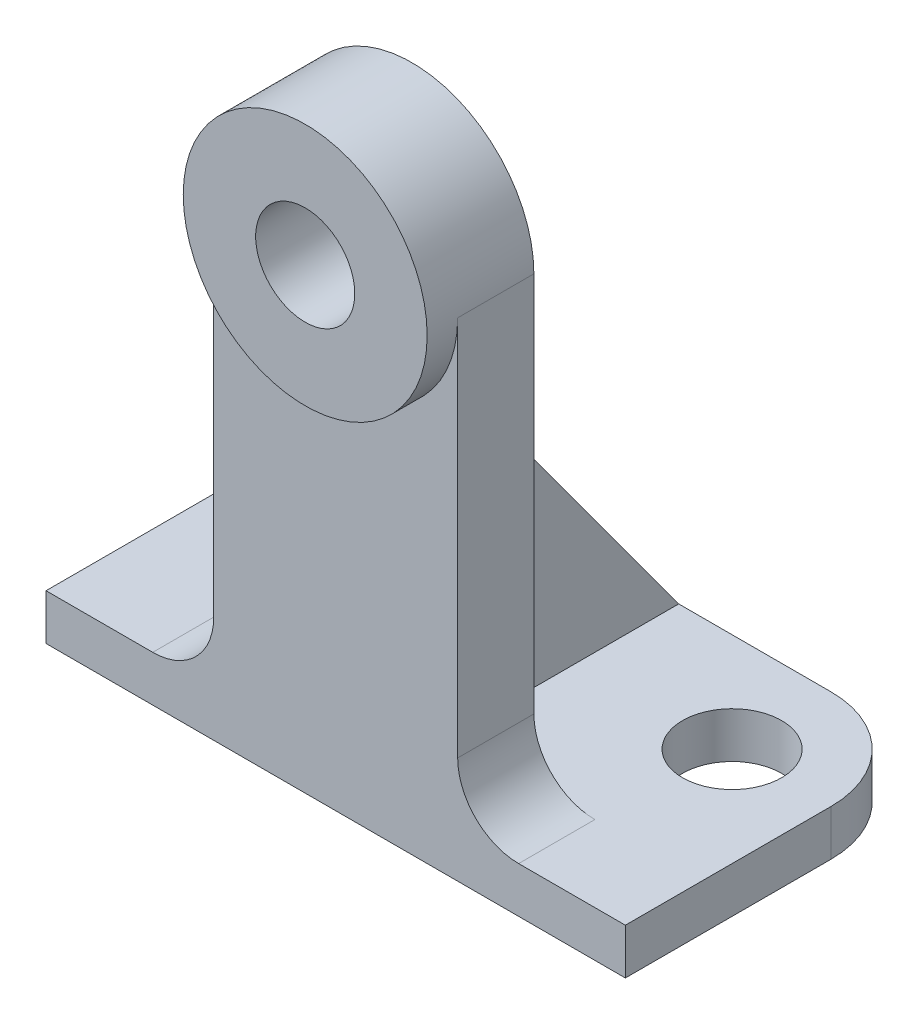
ISO-10303-21;
HEADER;
FILE_DESCRIPTION(('STEP AP214'),'2;1');
FILE_NAME('part.step','',(''),(''),'','','');
FILE_SCHEMA(('AUTOMOTIVE_DESIGN { 1 0 10303 214 1 1 1 1 }'));
ENDSEC;
DATA;
#1=APPLICATION_CONTEXT('core data for automotive mechanical design processes');
#2=APPLICATION_PROTOCOL_DEFINITION('international standard','automotive_design',2000,#1);
#3=PRODUCT_CONTEXT('',#1,'mechanical');
#4=PRODUCT('Part','Part','',(#3));
#5=PRODUCT_RELATED_PRODUCT_CATEGORY('part','',(#4));
#6=PRODUCT_DEFINITION_FORMATION('','',#4);
#7=PRODUCT_DEFINITION_CONTEXT('part definition',#1,'design');
#8=PRODUCT_DEFINITION('design','',#6,#7);
#9=PRODUCT_DEFINITION_SHAPE('','',#8);
#10=(LENGTH_UNIT() NAMED_UNIT(*) SI_UNIT(.MILLI.,.METRE.));
#11=(NAMED_UNIT(*) PLANE_ANGLE_UNIT() SI_UNIT($,.RADIAN.));
#12=(NAMED_UNIT(*) SI_UNIT($,.STERADIAN.) SOLID_ANGLE_UNIT());
#13=UNCERTAINTY_MEASURE_WITH_UNIT(LENGTH_MEASURE(1.E-05),#10,'distance_accuracy_value','');
#14=(GEOMETRIC_REPRESENTATION_CONTEXT(3) GLOBAL_UNCERTAINTY_ASSIGNED_CONTEXT((#13)) GLOBAL_UNIT_ASSIGNED_CONTEXT((#10,
#11,#12)) REPRESENTATION_CONTEXT('',''));
#15=CARTESIAN_POINT('',(0.,0.,0.));
#16=DIRECTION('',(0.,0.,1.));
#17=DIRECTION('',(1.,0.,0.));
#18=AXIS2_PLACEMENT_3D('',#15,#16,#17);
#19=CARTESIAN_POINT('',(0.,0.,0.));
#20=DIRECTION('',(0.,1.,0.));
#21=DIRECTION('',(0.,0.,1.));
#22=AXIS2_PLACEMENT_3D('',#19,#20,#21);
#23=PLANE('',#22);
#24=CARTESIAN_POINT('',(-25.,0.,-7.));
#25=DIRECTION('',(0.,1.,0.));
#26=DIRECTION('',(0.,0.,-1.));
#27=AXIS2_PLACEMENT_3D('',#24,#25,#26);
#28=CIRCLE('',#27,6.5);
#29=CARTESIAN_POINT('',(-25.,0.,-13.5));
#30=VERTEX_POINT('',#29);
#31=EDGE_CURVE('E225',#30,#30,#28,.T.);
#32=ORIENTED_EDGE('',*,*,#31,.F.);
#33=EDGE_LOOP('',(#32));
#34=FACE_BOUND('',#33,.T.);
#35=DIRECTION('',(-1.,0.,0.));
#36=VECTOR('',#35,1.);
#37=CARTESIAN_POINT('',(-38.,0.,-20.));
#38=LINE('',#37,#36);
#39=CARTESIAN_POINT('',(-5.,0.,-20.));
#40=VERTEX_POINT('',#39);
#41=CARTESIAN_POINT('',(-25.,0.,-20.));
#42=VERTEX_POINT('',#41);
#43=EDGE_CURVE('E174',#40,#42,#38,.T.);
#44=ORIENTED_EDGE('',*,*,#43,.T.);
#45=CARTESIAN_POINT('',(-25.,0.,-7.));
#46=DIRECTION('',(0.,1.,0.));
#47=DIRECTION('',(0.,0.,1.));
#48=AXIS2_PLACEMENT_3D('',#45,#46,#47);
#49=CIRCLE('',#48,13.);
#50=CARTESIAN_POINT('',(-38.,0.,-7.));
#51=VERTEX_POINT('',#50);
#52=EDGE_CURVE('E211',#42,#51,#49,.T.);
#53=ORIENTED_EDGE('',*,*,#52,.T.);
#54=DIRECTION('',(0.,0.,1.));
#55=VECTOR('',#54,1.);
#56=CARTESIAN_POINT('',(-38.,0.,-20.));
#57=LINE('',#56,#55);
#58=CARTESIAN_POINT('',(-38.,0.,20.));
#59=VERTEX_POINT('',#58);
#60=EDGE_CURVE('E188',#51,#59,#57,.T.);
#61=ORIENTED_EDGE('',*,*,#60,.T.);
#62=DIRECTION('',(1.,0.,0.));
#63=VECTOR('',#62,1.);
#64=CARTESIAN_POINT('',(-38.,0.,20.));
#65=LINE('',#64,#63);
#66=CARTESIAN_POINT('',(-24.,0.,20.));
#67=VERTEX_POINT('',#66);
#68=EDGE_CURVE('E196',#59,#67,#65,.T.);
#69=ORIENTED_EDGE('',*,*,#68,.T.);
#70=DIRECTION('',(0.,0.,1.));
#71=VECTOR('',#70,1.);
#72=CARTESIAN_POINT('',(-24.,0.,10.));
#73=LINE('',#72,#71);
#74=CARTESIAN_POINT('',(-24.,0.,10.));
#75=VERTEX_POINT('',#74);
#76=EDGE_CURVE('E268',#75,#67,#73,.T.);
#77=ORIENTED_EDGE('',*,*,#76,.F.);
#78=DIRECTION('',(-1.,0.,0.));
#79=VECTOR('',#78,1.);
#80=CARTESIAN_POINT('',(0.,0.,10.));
#81=LINE('',#80,#79);
#82=CARTESIAN_POINT('',(-5.,0.,10.));
#83=VERTEX_POINT('',#82);
#84=EDGE_CURVE('E176',#83,#75,#81,.T.);
#85=ORIENTED_EDGE('',*,*,#84,.F.);
#86=DIRECTION('',(0.,0.,1.));
#87=VECTOR('',#86,1.);
#88=CARTESIAN_POINT('',(-5.,0.,-20.));
#89=LINE('',#88,#87);
#90=EDGE_CURVE('E169',#40,#83,#89,.T.);
#91=ORIENTED_EDGE('',*,*,#90,.F.);
#92=EDGE_LOOP('',(#44,#53,#61,#69,#77,#85,#91));
#93=FACE_BOUND('',#92,.T.);
#94=ADVANCED_FACE('F41',(#34,#93),#23,.T.);
#95=CARTESIAN_POINT('',(25.,0.,-7.));
#96=DIRECTION('',(0.,1.,0.));
#97=DIRECTION('',(0.,0.,1.));
#98=AXIS2_PLACEMENT_3D('',#95,#96,#97);
#99=CIRCLE('',#98,6.5);
#100=CARTESIAN_POINT('',(25.,0.,-0.500000000000004));
#101=VERTEX_POINT('',#100);
#102=EDGE_CURVE('E220',#101,#101,#99,.T.);
#103=ORIENTED_EDGE('',*,*,#102,.F.);
#104=EDGE_LOOP('',(#103));
#105=FACE_BOUND('',#104,.T.);
#106=DIRECTION('',(0.,0.,-1.));
#107=VECTOR('',#106,1.);
#108=CARTESIAN_POINT('',(38.,0.,-20.));
#109=LINE('',#108,#107);
#110=CARTESIAN_POINT('',(38.,0.,20.));
#111=VERTEX_POINT('',#110);
#112=CARTESIAN_POINT('',(38.,0.,-7.));
#113=VERTEX_POINT('',#112);
#114=EDGE_CURVE('E186',#111,#113,#109,.T.);
#115=ORIENTED_EDGE('',*,*,#114,.T.);
#116=CARTESIAN_POINT('',(25.,0.,-7.));
#117=DIRECTION('',(0.,1.,0.));
#118=DIRECTION('',(0.,0.,1.));
#119=AXIS2_PLACEMENT_3D('',#116,#117,#118);
#120=CIRCLE('',#119,13.);
#121=CARTESIAN_POINT('',(25.,0.,-20.));
#122=VERTEX_POINT('',#121);
#123=EDGE_CURVE('E11',#113,#122,#120,.T.);
#124=ORIENTED_EDGE('',*,*,#123,.T.);
#125=CARTESIAN_POINT('',(5.,0.,-20.));
#126=VERTEX_POINT('',#125);
#127=EDGE_CURVE('E185',#122,#126,#38,.T.);
#128=ORIENTED_EDGE('',*,*,#127,.T.);
#129=DIRECTION('',(0.,0.,1.));
#130=VECTOR('',#129,1.);
#131=CARTESIAN_POINT('',(5.,0.,-20.));
#132=LINE('',#131,#130);
#133=CARTESIAN_POINT('',(5.,0.,10.));
#134=VERTEX_POINT('',#133);
#135=EDGE_CURVE('E178',#126,#134,#132,.T.);
#136=ORIENTED_EDGE('',*,*,#135,.T.);
#137=CARTESIAN_POINT('',(24.,0.,10.));
#138=VERTEX_POINT('',#137);
#139=EDGE_CURVE('E252',#138,#134,#81,.T.);
#140=ORIENTED_EDGE('',*,*,#139,.F.);
#141=DIRECTION('',(0.,0.,1.));
#142=VECTOR('',#141,1.);
#143=CARTESIAN_POINT('',(24.,0.,10.));
#144=LINE('',#143,#142);
#145=CARTESIAN_POINT('',(24.,0.,20.));
#146=VERTEX_POINT('',#145);
#147=EDGE_CURVE('E288',#138,#146,#144,.T.);
#148=ORIENTED_EDGE('',*,*,#147,.T.);
#149=EDGE_CURVE('E195',#146,#111,#65,.T.);
#150=ORIENTED_EDGE('',*,*,#149,.T.);
#151=EDGE_LOOP('',(#115,#124,#128,#136,#140,#148,#150));
#152=FACE_BOUND('',#151,.T.);
#153=ADVANCED_FACE('F341',(#105,#152),#23,.T.);
#154=CARTESIAN_POINT('',(0.,0.,10.));
#155=DIRECTION('',(0.,0.,1.));
#156=DIRECTION('',(1.,0.,0.));
#157=AXIS2_PLACEMENT_3D('',#154,#155,#156);
#158=PLANE('',#157);
#159=DIRECTION('',(0.,-1.,0.));
#160=VECTOR('',#159,1.);
#161=CARTESIAN_POINT('',(5.,0.,10.));
#162=LINE('',#161,#160);
#163=CARTESIAN_POINT('',(5.,41.,10.));
#164=VERTEX_POINT('',#163);
#165=EDGE_CURVE('E235',#164,#134,#162,.T.);
#166=ORIENTED_EDGE('',*,*,#165,.F.);
#167=DIRECTION('',(1.,0.,0.));
#168=VECTOR('',#167,1.);
#169=CARTESIAN_POINT('',(5.,41.,10.));
#170=LINE('',#169,#168);
#171=CARTESIAN_POINT('',(-5.,41.,10.));
#172=VERTEX_POINT('',#171);
#173=EDGE_CURVE('E233',#172,#164,#170,.T.);
#174=ORIENTED_EDGE('',*,*,#173,.F.);
#175=DIRECTION('',(0.,1.,0.));
#176=VECTOR('',#175,1.);
#177=CARTESIAN_POINT('',(-5.,41.,10.));
#178=LINE('',#177,#176);
#179=EDGE_CURVE('E162',#83,#172,#178,.T.);
#180=ORIENTED_EDGE('',*,*,#179,.F.);
#181=ORIENTED_EDGE('',*,*,#84,.T.);
#182=CARTESIAN_POINT('',(-24.,8.,10.));
#183=DIRECTION('',(0.,0.,1.));
#184=DIRECTION('',(1.,0.,0.));
#185=AXIS2_PLACEMENT_3D('',#182,#183,#184);
#186=CIRCLE('',#185,8.);
#187=CARTESIAN_POINT('',(-16.,8.,10.));
#188=VERTEX_POINT('',#187);
#189=EDGE_CURVE('E248',#188,#75,#186,.F.);
#190=ORIENTED_EDGE('',*,*,#189,.F.);
#191=DIRECTION('',(0.,-1.,0.));
#192=VECTOR('',#191,1.);
#193=CARTESIAN_POINT('',(-16.,0.,10.));
#194=LINE('',#193,#192);
#195=CARTESIAN_POINT('',(-16.,58.,10.));
#196=VERTEX_POINT('',#195);
#197=EDGE_CURVE('E262',#196,#188,#194,.T.);
#198=ORIENTED_EDGE('',*,*,#197,.F.);
#199=CARTESIAN_POINT('',(0.,58.,10.));
#200=DIRECTION('',(0.,0.,1.));
#201=DIRECTION('',(1.,0.,0.));
#202=AXIS2_PLACEMENT_3D('',#199,#200,#201);
#203=CIRCLE('',#202,16.);
#204=CARTESIAN_POINT('',(16.,58.,10.));
#205=VERTEX_POINT('',#204);
#206=EDGE_CURVE('E259',#205,#196,#203,.T.);
#207=ORIENTED_EDGE('',*,*,#206,.F.);
#208=DIRECTION('',(0.,-1.,0.));
#209=VECTOR('',#208,1.);
#210=CARTESIAN_POINT('',(16.,0.,10.));
#211=LINE('',#210,#209);
#212=CARTESIAN_POINT('',(16.,8.,10.));
#213=VERTEX_POINT('',#212);
#214=EDGE_CURVE('E257',#205,#213,#211,.T.);
#215=ORIENTED_EDGE('',*,*,#214,.T.);
#216=CARTESIAN_POINT('',(24.,8.,10.));
#217=DIRECTION('',(0.,0.,1.));
#218=DIRECTION('',(1.,0.,0.));
#219=AXIS2_PLACEMENT_3D('',#216,#217,#218);
#220=CIRCLE('',#219,8.);
#221=EDGE_CURVE('E254',#213,#138,#220,.T.);
#222=ORIENTED_EDGE('',*,*,#221,.T.);
#223=ORIENTED_EDGE('',*,*,#139,.T.);
#224=EDGE_LOOP('',(#166,#174,#180,#181,#190,#198,#207,#215,#222,#223));
#225=FACE_BOUND('',#224,.T.);
#226=CARTESIAN_POINT('',(0.,58.,10.));
#227=DIRECTION('',(0.,0.,1.));
#228=DIRECTION('',(1.,0.,0.));
#229=AXIS2_PLACEMENT_3D('',#226,#227,#228);
#230=CIRCLE('',#229,6.5);
#231=CARTESIAN_POINT('',(6.5,58.,10.));
#232=VERTEX_POINT('',#231);
#233=EDGE_CURVE('E265',#232,#232,#230,.T.);
#234=ORIENTED_EDGE('',*,*,#233,.T.);
#235=EDGE_LOOP('',(#234));
#236=FACE_BOUND('',#235,.T.);
#237=ADVANCED_FACE('F322',(#225,#236),#158,.F.);
#238=CARTESIAN_POINT('',(38.,-6.,-20.));
#239=DIRECTION('',(1.,0.,0.));
#240=DIRECTION('',(0.,0.,-1.));
#241=AXIS2_PLACEMENT_3D('',#238,#239,#240);
#242=PLANE('',#241);
#243=DIRECTION('',(0.,0.,-1.));
#244=VECTOR('',#243,1.);
#245=CARTESIAN_POINT('',(38.,-6.,-20.));
#246=LINE('',#245,#244);
#247=CARTESIAN_POINT('',(38.,-6.,20.));
#248=VERTEX_POINT('',#247);
#249=CARTESIAN_POINT('',(38.,-6.,-7.));
#250=VERTEX_POINT('',#249);
#251=EDGE_CURVE('E198',#248,#250,#246,.T.);
#252=ORIENTED_EDGE('',*,*,#251,.T.);
#253=DIRECTION('',(0.,1.,0.));
#254=VECTOR('',#253,1.);
#255=CARTESIAN_POINT('',(38.,-6.,-7.));
#256=LINE('',#255,#254);
#257=EDGE_CURVE('E50',#250,#113,#256,.T.);
#258=ORIENTED_EDGE('',*,*,#257,.T.);
#259=ORIENTED_EDGE('',*,*,#114,.F.);
#260=DIRECTION('',(0.,1.,0.));
#261=VECTOR('',#260,1.);
#262=CARTESIAN_POINT('',(38.,-6.,20.));
#263=LINE('',#262,#261);
#264=EDGE_CURVE('E199',#248,#111,#263,.T.);
#265=ORIENTED_EDGE('',*,*,#264,.F.);
#266=EDGE_LOOP('',(#252,#258,#259,#265));
#267=FACE_BOUND('',#266,.T.);
#268=ADVANCED_FACE('F308',(#267),#242,.T.);
#269=CARTESIAN_POINT('',(-38.,-6.,20.));
#270=DIRECTION('',(0.,0.,1.));
#271=DIRECTION('',(1.,0.,0.));
#272=AXIS2_PLACEMENT_3D('',#269,#270,#271);
#273=PLANE('',#272);
#274=CARTESIAN_POINT('',(0.,58.,20.));
#275=DIRECTION('',(0.,0.,1.));
#276=DIRECTION('',(1.,0.,0.));
#277=AXIS2_PLACEMENT_3D('',#274,#275,#276);
#278=CIRCLE('',#277,16.);
#279=CARTESIAN_POINT('',(-16.,58.,20.));
#280=VERTEX_POINT('',#279);
#281=CARTESIAN_POINT('',(16.,58.,20.));
#282=VERTEX_POINT('',#281);
#283=EDGE_CURVE('E202',#280,#282,#278,.T.);
#284=ORIENTED_EDGE('',*,*,#283,.F.);
#285=DIRECTION('',(0.,-1.,0.));
#286=VECTOR('',#285,1.);
#287=CARTESIAN_POINT('',(-16.,0.,20.));
#288=LINE('',#287,#286);
#289=CARTESIAN_POINT('',(-16.,8.,20.));
#290=VERTEX_POINT('',#289);
#291=EDGE_CURVE('E251',#280,#290,#288,.T.);
#292=ORIENTED_EDGE('',*,*,#291,.T.);
#293=CARTESIAN_POINT('',(-24.,8.,20.));
#294=DIRECTION('',(0.,0.,1.));
#295=DIRECTION('',(1.,0.,0.));
#296=AXIS2_PLACEMENT_3D('',#293,#294,#295);
#297=CIRCLE('',#296,8.);
#298=EDGE_CURVE('E245',#290,#67,#297,.F.);
#299=ORIENTED_EDGE('',*,*,#298,.T.);
#300=ORIENTED_EDGE('',*,*,#68,.F.);
#301=DIRECTION('',(0.,1.,0.));
#302=VECTOR('',#301,1.);
#303=CARTESIAN_POINT('',(-38.,-6.,20.));
#304=LINE('',#303,#302);
#305=CARTESIAN_POINT('',(-38.,-6.,20.));
#306=VERTEX_POINT('',#305);
#307=EDGE_CURVE('E203',#306,#59,#304,.T.);
#308=ORIENTED_EDGE('',*,*,#307,.F.);
#309=DIRECTION('',(1.,0.,0.));
#310=VECTOR('',#309,1.);
#311=CARTESIAN_POINT('',(-38.,-6.,20.));
#312=LINE('',#311,#310);
#313=EDGE_CURVE('E206',#306,#248,#312,.T.);
#314=ORIENTED_EDGE('',*,*,#313,.T.);
#315=ORIENTED_EDGE('',*,*,#264,.T.);
#316=ORIENTED_EDGE('',*,*,#149,.F.);
#317=CARTESIAN_POINT('',(24.,8.,20.));
#318=DIRECTION('',(0.,0.,1.));
#319=DIRECTION('',(1.,0.,0.));
#320=AXIS2_PLACEMENT_3D('',#317,#318,#319);
#321=CIRCLE('',#320,8.);
#322=CARTESIAN_POINT('',(16.,8.,20.));
#323=VERTEX_POINT('',#322);
#324=EDGE_CURVE('E271',#323,#146,#321,.T.);
#325=ORIENTED_EDGE('',*,*,#324,.F.);
#326=DIRECTION('',(0.,-1.,0.));
#327=VECTOR('',#326,1.);
#328=CARTESIAN_POINT('',(16.,0.,20.));
#329=LINE('',#328,#327);
#330=EDGE_CURVE('E274',#282,#323,#329,.T.);
#331=ORIENTED_EDGE('',*,*,#330,.F.);
#332=EDGE_LOOP('',(#284,#292,#299,#300,#308,#314,#315,#316,#325,#331));
#333=FACE_BOUND('',#332,.T.);
#334=ADVANCED_FACE('F301',(#333),#273,.T.);
#335=CARTESIAN_POINT('',(-38.,-6.,-20.));
#336=DIRECTION('',(-1.,0.,0.));
#337=DIRECTION('',(0.,0.,1.));
#338=AXIS2_PLACEMENT_3D('',#335,#336,#337);
#339=PLANE('',#338);
#340=ORIENTED_EDGE('',*,*,#60,.F.);
#341=DIRECTION('',(0.,1.,0.));
#342=VECTOR('',#341,1.);
#343=CARTESIAN_POINT('',(-38.,-6.,-7.));
#344=LINE('',#343,#342);
#345=CARTESIAN_POINT('',(-38.,-6.,-7.));
#346=VERTEX_POINT('',#345);
#347=EDGE_CURVE('E213',#51,#346,#344,.F.);
#348=ORIENTED_EDGE('',*,*,#347,.T.);
#349=DIRECTION('',(0.,0.,1.));
#350=VECTOR('',#349,1.);
#351=CARTESIAN_POINT('',(-38.,-6.,-20.));
#352=LINE('',#351,#350);
#353=EDGE_CURVE('E296',#346,#306,#352,.T.);
#354=ORIENTED_EDGE('',*,*,#353,.T.);
#355=ORIENTED_EDGE('',*,*,#307,.T.);
#356=EDGE_LOOP('',(#340,#348,#354,#355));
#357=FACE_BOUND('',#356,.T.);
#358=ADVANCED_FACE('F314',(#357),#339,.T.);
#359=CARTESIAN_POINT('',(-38.,-6.,-20.));
#360=DIRECTION('',(0.,0.,-1.));
#361=DIRECTION('',(-1.,0.,0.));
#362=AXIS2_PLACEMENT_3D('',#359,#360,#361);
#363=PLANE('',#362);
#364=DIRECTION('',(-1.,0.,0.));
#365=VECTOR('',#364,1.);
#366=CARTESIAN_POINT('',(-38.,-6.,-20.));
#367=LINE('',#366,#365);
#368=CARTESIAN_POINT('',(25.,-6.,-20.));
#369=VERTEX_POINT('',#368);
#370=CARTESIAN_POINT('',(-25.,-6.,-20.));
#371=VERTEX_POINT('',#370);
#372=EDGE_CURVE('E294',#369,#371,#367,.T.);
#373=ORIENTED_EDGE('',*,*,#372,.T.);
#374=DIRECTION('',(0.,1.,0.));
#375=VECTOR('',#374,1.);
#376=CARTESIAN_POINT('',(-25.,-6.,-20.));
#377=LINE('',#376,#375);
#378=EDGE_CURVE('E184',#371,#42,#377,.T.);
#379=ORIENTED_EDGE('',*,*,#378,.T.);
#380=ORIENTED_EDGE('',*,*,#43,.F.);
#381=DIRECTION('',(-1.,0.,0.));
#382=VECTOR('',#381,1.);
#383=CARTESIAN_POINT('',(25.,0.,-20.));
#384=LINE('',#383,#382);
#385=EDGE_CURVE('E151',#126,#40,#384,.T.);
#386=ORIENTED_EDGE('',*,*,#385,.F.);
#387=ORIENTED_EDGE('',*,*,#127,.F.);
#388=DIRECTION('',(0.,1.,0.));
#389=VECTOR('',#388,1.);
#390=CARTESIAN_POINT('',(25.,-6.,-20.));
#391=LINE('',#390,#389);
#392=EDGE_CURVE('E208',#122,#369,#391,.F.);
#393=ORIENTED_EDGE('',*,*,#392,.T.);
#394=EDGE_LOOP('',(#373,#379,#380,#386,#387,#393));
#395=FACE_BOUND('',#394,.T.);
#396=ADVANCED_FACE('F182',(#395),#363,.T.);
#397=CARTESIAN_POINT('',(0.,-6.,0.));
#398=DIRECTION('',(0.,1.,0.));
#399=DIRECTION('',(0.,0.,1.));
#400=AXIS2_PLACEMENT_3D('',#397,#398,#399);
#401=PLANE('',#400);
#402=CARTESIAN_POINT('',(25.,-6.,-7.));
#403=DIRECTION('',(0.,1.,0.));
#404=DIRECTION('',(0.,0.,1.));
#405=AXIS2_PLACEMENT_3D('',#402,#403,#404);
#406=CIRCLE('',#405,6.5);
#407=CARTESIAN_POINT('',(25.,-6.,-0.500000000000004));
#408=VERTEX_POINT('',#407);
#409=EDGE_CURVE('E45',#408,#408,#406,.T.);
#410=ORIENTED_EDGE('',*,*,#409,.T.);
#411=EDGE_LOOP('',(#410));
#412=FACE_BOUND('',#411,.T.);
#413=CARTESIAN_POINT('',(-25.,-6.,-7.));
#414=DIRECTION('',(0.,1.,0.));
#415=DIRECTION('',(0.,0.,1.));
#416=AXIS2_PLACEMENT_3D('',#413,#414,#415);
#417=CIRCLE('',#416,6.5);
#418=CARTESIAN_POINT('',(-25.,-6.,-0.500000000000004));
#419=VERTEX_POINT('',#418);
#420=EDGE_CURVE('E218',#419,#419,#417,.T.);
#421=ORIENTED_EDGE('',*,*,#420,.T.);
#422=EDGE_LOOP('',(#421));
#423=FACE_BOUND('',#422,.T.);
#424=ORIENTED_EDGE('',*,*,#353,.F.);
#425=CARTESIAN_POINT('',(-25.,-6.,-7.));
#426=DIRECTION('',(0.,1.,0.));
#427=DIRECTION('',(0.,0.,1.));
#428=AXIS2_PLACEMENT_3D('',#425,#426,#427);
#429=CIRCLE('',#428,13.);
#430=EDGE_CURVE('E216',#346,#371,#429,.F.);
#431=ORIENTED_EDGE('',*,*,#430,.T.);
#432=ORIENTED_EDGE('',*,*,#372,.F.);
#433=CARTESIAN_POINT('',(25.,-6.,-7.));
#434=DIRECTION('',(0.,1.,0.));
#435=DIRECTION('',(0.,0.,1.));
#436=AXIS2_PLACEMENT_3D('',#433,#434,#435);
#437=CIRCLE('',#436,13.);
#438=EDGE_CURVE('E64',#369,#250,#437,.F.);
#439=ORIENTED_EDGE('',*,*,#438,.T.);
#440=ORIENTED_EDGE('',*,*,#251,.F.);
#441=ORIENTED_EDGE('',*,*,#313,.F.);
#442=EDGE_LOOP('',(#424,#431,#432,#439,#440,#441));
#443=FACE_BOUND('',#442,.T.);
#444=ADVANCED_FACE('F305',(#412,#423,#443),#401,.F.);
#445=CARTESIAN_POINT('',(-24.,8.,10.));
#446=DIRECTION('',(0.,0.,1.));
#447=DIRECTION('',(1.,0.,0.));
#448=AXIS2_PLACEMENT_3D('',#445,#446,#447);
#449=CYLINDRICAL_SURFACE('',#448,8.);
#450=ORIENTED_EDGE('',*,*,#298,.F.);
#451=DIRECTION('',(0.,0.,1.));
#452=VECTOR('',#451,1.);
#453=CARTESIAN_POINT('',(-16.,8.,10.));
#454=LINE('',#453,#452);
#455=EDGE_CURVE('E190',#188,#290,#454,.T.);
#456=ORIENTED_EDGE('',*,*,#455,.F.);
#457=ORIENTED_EDGE('',*,*,#189,.T.);
#458=ORIENTED_EDGE('',*,*,#76,.T.);
#459=EDGE_LOOP('',(#450,#456,#457,#458));
#460=FACE_BOUND('',#459,.T.);
#461=ADVANCED_FACE('F317',(#460),#449,.F.);
#462=CARTESIAN_POINT('',(-16.,0.,10.));
#463=DIRECTION('',(-1.,0.,0.));
#464=DIRECTION('',(0.,0.,1.));
#465=AXIS2_PLACEMENT_3D('',#462,#463,#464);
#466=PLANE('',#465);
#467=ORIENTED_EDGE('',*,*,#291,.F.);
#468=DIRECTION('',(0.,0.,1.));
#469=VECTOR('',#468,1.);
#470=CARTESIAN_POINT('',(-16.,58.,10.));
#471=LINE('',#470,#469);
#472=EDGE_CURVE('E279',#196,#280,#471,.T.);
#473=ORIENTED_EDGE('',*,*,#472,.F.);
#474=ORIENTED_EDGE('',*,*,#197,.T.);
#475=ORIENTED_EDGE('',*,*,#455,.T.);
#476=EDGE_LOOP('',(#467,#473,#474,#475));
#477=FACE_BOUND('',#476,.T.);
#478=ADVANCED_FACE('F327',(#477),#466,.T.);
#479=CARTESIAN_POINT('',(0.,58.,10.));
#480=DIRECTION('',(0.,0.,1.));
#481=DIRECTION('',(1.,0.,0.));
#482=AXIS2_PLACEMENT_3D('',#479,#480,#481);
#483=CYLINDRICAL_SURFACE('',#482,16.);
#484=ORIENTED_EDGE('',*,*,#472,.T.);
#485=ORIENTED_EDGE('',*,*,#283,.T.);
#486=DIRECTION('',(0.,0.,1.));
#487=VECTOR('',#486,1.);
#488=CARTESIAN_POINT('',(16.,58.,10.));
#489=LINE('',#488,#487);
#490=EDGE_CURVE('E282',#205,#282,#489,.T.);
#491=ORIENTED_EDGE('',*,*,#490,.F.);
#492=ORIENTED_EDGE('',*,*,#206,.T.);
#493=EDGE_LOOP('',(#484,#485,#491,#492));
#494=FACE_BOUND('',#493,.T.);
#495=CARTESIAN_POINT('',(0.,58.,24.));
#496=DIRECTION('',(0.,0.,1.));
#497=DIRECTION('',(1.,0.,0.));
#498=AXIS2_PLACEMENT_3D('',#495,#496,#497);
#499=CIRCLE('',#498,16.);
#500=CARTESIAN_POINT('',(16.,58.,24.));
#501=VERTEX_POINT('',#500);
#502=EDGE_CURVE('E242',#501,#501,#499,.T.);
#503=ORIENTED_EDGE('',*,*,#502,.F.);
#504=EDGE_LOOP('',(#503));
#505=FACE_BOUND('',#504,.T.);
#506=ADVANCED_FACE('F329',(#494,#505),#483,.T.);
#507=CARTESIAN_POINT('',(16.,0.,10.));
#508=DIRECTION('',(-1.,0.,0.));
#509=DIRECTION('',(0.,0.,1.));
#510=AXIS2_PLACEMENT_3D('',#507,#508,#509);
#511=PLANE('',#510);
#512=ORIENTED_EDGE('',*,*,#330,.T.);
#513=DIRECTION('',(0.,0.,1.));
#514=VECTOR('',#513,1.);
#515=CARTESIAN_POINT('',(16.,8.,10.));
#516=LINE('',#515,#514);
#517=EDGE_CURVE('E285',#213,#323,#516,.T.);
#518=ORIENTED_EDGE('',*,*,#517,.F.);
#519=ORIENTED_EDGE('',*,*,#214,.F.);
#520=ORIENTED_EDGE('',*,*,#490,.T.);
#521=EDGE_LOOP('',(#512,#518,#519,#520));
#522=FACE_BOUND('',#521,.T.);
#523=ADVANCED_FACE('F336',(#522),#511,.F.);
#524=CARTESIAN_POINT('',(24.,8.,10.));
#525=DIRECTION('',(0.,0.,1.));
#526=DIRECTION('',(1.,0.,0.));
#527=AXIS2_PLACEMENT_3D('',#524,#525,#526);
#528=CYLINDRICAL_SURFACE('',#527,8.);
#529=ORIENTED_EDGE('',*,*,#324,.T.);
#530=ORIENTED_EDGE('',*,*,#147,.F.);
#531=ORIENTED_EDGE('',*,*,#221,.F.);
#532=ORIENTED_EDGE('',*,*,#517,.T.);
#533=EDGE_LOOP('',(#529,#530,#531,#532));
#534=FACE_BOUND('',#533,.T.);
#535=ADVANCED_FACE('F339',(#534),#528,.F.);
#536=CARTESIAN_POINT('',(0.,58.,10.));
#537=DIRECTION('',(0.,0.,1.));
#538=DIRECTION('',(1.,0.,0.));
#539=AXIS2_PLACEMENT_3D('',#536,#537,#538);
#540=CYLINDRICAL_SURFACE('',#539,6.5);
#541=ORIENTED_EDGE('',*,*,#233,.F.);
#542=EDGE_LOOP('',(#541));
#543=FACE_BOUND('',#542,.T.);
#544=CARTESIAN_POINT('',(0.,58.,24.));
#545=DIRECTION('',(0.,0.,1.));
#546=DIRECTION('',(1.,0.,0.));
#547=AXIS2_PLACEMENT_3D('',#544,#545,#546);
#548=CIRCLE('',#547,6.5);
#549=CARTESIAN_POINT('',(6.5,58.,24.));
#550=VERTEX_POINT('',#549);
#551=EDGE_CURVE('E177',#550,#550,#548,.T.);
#552=ORIENTED_EDGE('',*,*,#551,.T.);
#553=EDGE_LOOP('',(#552));
#554=FACE_BOUND('',#553,.T.);
#555=ADVANCED_FACE('F403',(#543,#554),#540,.F.);
#556=CARTESIAN_POINT('',(0.,58.,24.));
#557=DIRECTION('',(0.,0.,1.));
#558=DIRECTION('',(1.,0.,0.));
#559=AXIS2_PLACEMENT_3D('',#556,#557,#558);
#560=PLANE('',#559);
#561=ORIENTED_EDGE('',*,*,#502,.T.);
#562=EDGE_LOOP('',(#561));
#563=FACE_BOUND('',#562,.T.);
#564=ORIENTED_EDGE('',*,*,#551,.F.);
#565=EDGE_LOOP('',(#564));
#566=FACE_BOUND('',#565,.T.);
#567=ADVANCED_FACE('F351',(#563,#566),#560,.T.);
#568=CARTESIAN_POINT('',(-5.,41.,-20.));
#569=DIRECTION('',(1.,0.,0.));
#570=DIRECTION('',(0.,1.,0.));
#571=AXIS2_PLACEMENT_3D('',#568,#569,#570);
#572=PLANE('',#571);
#573=ORIENTED_EDGE('',*,*,#179,.T.);
#574=DIRECTION('',(0.,0.80703032565843,0.590509994384217));
#575=VECTOR('',#574,1.);
#576=CARTESIAN_POINT('',(-5.,0.,-20.));
#577=LINE('',#576,#575);
#578=EDGE_CURVE('E154',#40,#172,#577,.T.);
#579=ORIENTED_EDGE('',*,*,#578,.F.);
#580=ORIENTED_EDGE('',*,*,#90,.T.);
#581=EDGE_LOOP('',(#573,#579,#580));
#582=FACE_BOUND('',#581,.T.);
#583=ADVANCED_FACE('F168',(#582),#572,.F.);
#584=CARTESIAN_POINT('',(5.,0.,-20.));
#585=DIRECTION('',(-1.,0.,0.));
#586=DIRECTION('',(0.,-1.,0.));
#587=AXIS2_PLACEMENT_3D('',#584,#585,#586);
#588=PLANE('',#587);
#589=ORIENTED_EDGE('',*,*,#135,.F.);
#590=DIRECTION('',(0.,0.80703032565843,0.590509994384217));
#591=VECTOR('',#590,1.);
#592=CARTESIAN_POINT('',(5.,0.,-20.));
#593=LINE('',#592,#591);
#594=EDGE_CURVE('E157',#126,#164,#593,.T.);
#595=ORIENTED_EDGE('',*,*,#594,.T.);
#596=ORIENTED_EDGE('',*,*,#165,.T.);
#597=EDGE_LOOP('',(#589,#595,#596));
#598=FACE_BOUND('',#597,.T.);
#599=ADVANCED_FACE('F343',(#598),#588,.F.);
#600=CARTESIAN_POINT('',(25.,0.,-20.));
#601=DIRECTION('',(0.,-0.590509994384217,0.80703032565843));
#602=DIRECTION('',(0.,-0.80703032565843,-0.590509994384217));
#603=AXIS2_PLACEMENT_3D('',#600,#601,#602);
#604=PLANE('',#603);
#605=ORIENTED_EDGE('',*,*,#385,.T.);
#606=ORIENTED_EDGE('',*,*,#578,.T.);
#607=ORIENTED_EDGE('',*,*,#173,.T.);
#608=ORIENTED_EDGE('',*,*,#594,.F.);
#609=EDGE_LOOP('',(#605,#606,#607,#608));
#610=FACE_BOUND('',#609,.T.);
#611=ADVANCED_FACE('F153',(#610),#604,.F.);
#612=CARTESIAN_POINT('',(-25.,-6.,-7.));
#613=DIRECTION('',(0.,1.,0.));
#614=DIRECTION('',(0.,0.,1.));
#615=AXIS2_PLACEMENT_3D('',#612,#613,#614);
#616=CYLINDRICAL_SURFACE('',#615,13.);
#617=ORIENTED_EDGE('',*,*,#430,.F.);
#618=ORIENTED_EDGE('',*,*,#347,.F.);
#619=ORIENTED_EDGE('',*,*,#52,.F.);
#620=ORIENTED_EDGE('',*,*,#378,.F.);
#621=EDGE_LOOP('',(#617,#618,#619,#620));
#622=FACE_BOUND('',#621,.T.);
#623=ADVANCED_FACE('F311',(#622),#616,.T.);
#624=CARTESIAN_POINT('',(25.,-6.,-7.));
#625=DIRECTION('',(0.,1.,0.));
#626=DIRECTION('',(0.,0.,1.));
#627=AXIS2_PLACEMENT_3D('',#624,#625,#626);
#628=CYLINDRICAL_SURFACE('',#627,13.);
#629=ORIENTED_EDGE('',*,*,#438,.F.);
#630=ORIENTED_EDGE('',*,*,#392,.F.);
#631=ORIENTED_EDGE('',*,*,#123,.F.);
#632=ORIENTED_EDGE('',*,*,#257,.F.);
#633=EDGE_LOOP('',(#629,#630,#631,#632));
#634=FACE_BOUND('',#633,.T.);
#635=ADVANCED_FACE('F43',(#634),#628,.T.);
#636=CARTESIAN_POINT('',(-25.,-30.,-7.));
#637=DIRECTION('',(0.,1.,0.));
#638=DIRECTION('',(0.,0.,1.));
#639=AXIS2_PLACEMENT_3D('',#636,#637,#638);
#640=CYLINDRICAL_SURFACE('',#639,6.5);
#641=ORIENTED_EDGE('',*,*,#31,.T.);
#642=EDGE_LOOP('',(#641));
#643=FACE_BOUND('',#642,.T.);
#644=ORIENTED_EDGE('',*,*,#420,.F.);
#645=EDGE_LOOP('',(#644));
#646=FACE_BOUND('',#645,.T.);
#647=ADVANCED_FACE('F375',(#643,#646),#640,.F.);
#648=CARTESIAN_POINT('',(25.,-30.,-7.));
#649=DIRECTION('',(0.,1.,0.));
#650=DIRECTION('',(0.,0.,1.));
#651=AXIS2_PLACEMENT_3D('',#648,#649,#650);
#652=CYLINDRICAL_SURFACE('',#651,6.5);
#653=ORIENTED_EDGE('',*,*,#102,.T.);
#654=EDGE_LOOP('',(#653));
#655=FACE_BOUND('',#654,.T.);
#656=ORIENTED_EDGE('',*,*,#409,.F.);
#657=EDGE_LOOP('',(#656));
#658=FACE_BOUND('',#657,.T.);
#659=ADVANCED_FACE('F379',(#655,#658),#652,.F.);
#660=CLOSED_SHELL('',(#94,#153,#237,#268,#334,#358,#396,#444,#461,#478,#506,#523,#535,#555,#567,
#583,#599,#611,#623,#635,#647,#659));
#661=MANIFOLD_SOLID_BREP('B2',#660);
#662=ADVANCED_BREP_SHAPE_REPRESENTATION('',(#18,#661),#14);
#663=SHAPE_DEFINITION_REPRESENTATION(#9,#662);
ENDSEC;
END-ISO-10303-21;
